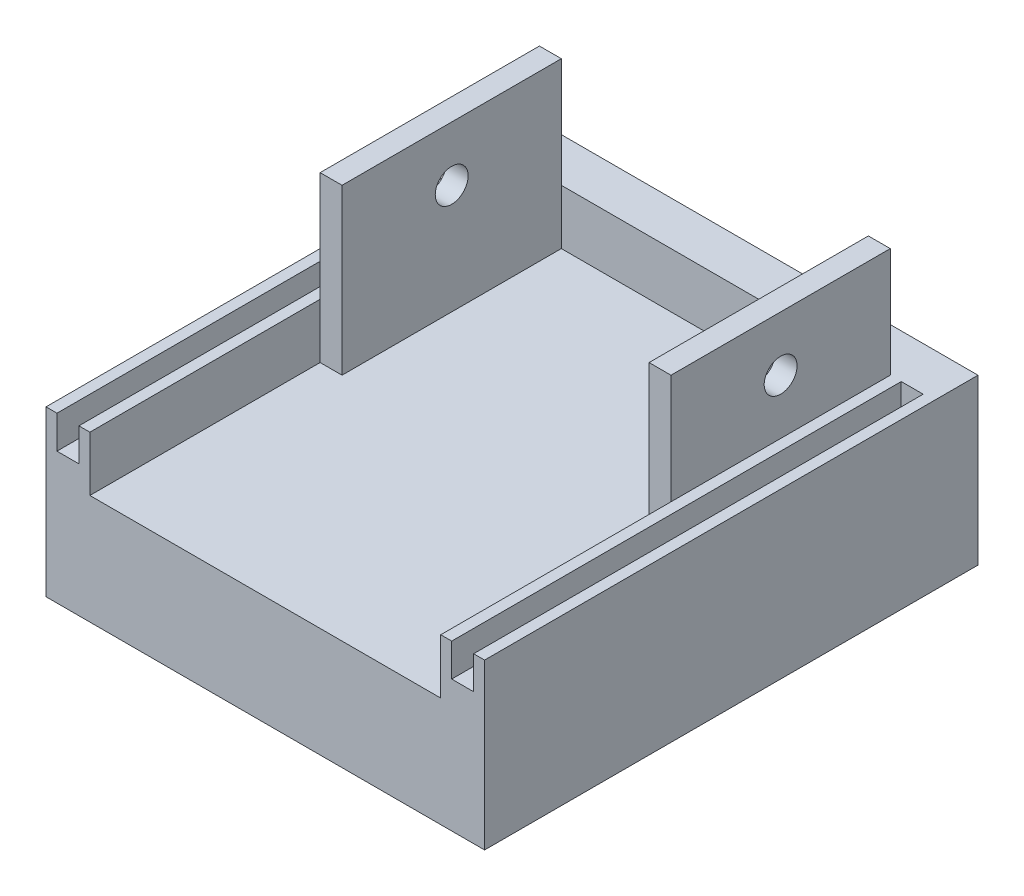
ISO-10303-21;
HEADER;
FILE_DESCRIPTION(('STEP AP214'),'2;1');
FILE_NAME('part.step','',(''),(''),'','','');
FILE_SCHEMA(('AUTOMOTIVE_DESIGN { 1 0 10303 214 1 1 1 1 }'));
ENDSEC;
DATA;
#1=APPLICATION_CONTEXT('core data for automotive mechanical design processes');
#2=APPLICATION_PROTOCOL_DEFINITION('international standard','automotive_design',2000,#1);
#3=PRODUCT_CONTEXT('',#1,'mechanical');
#4=PRODUCT('Part','Part','',(#3));
#5=PRODUCT_RELATED_PRODUCT_CATEGORY('part','',(#4));
#6=PRODUCT_DEFINITION_FORMATION('','',#4);
#7=PRODUCT_DEFINITION_CONTEXT('part definition',#1,'design');
#8=PRODUCT_DEFINITION('design','',#6,#7);
#9=PRODUCT_DEFINITION_SHAPE('','',#8);
#10=(LENGTH_UNIT() NAMED_UNIT(*) SI_UNIT(.MILLI.,.METRE.));
#11=(NAMED_UNIT(*) PLANE_ANGLE_UNIT() SI_UNIT($,.RADIAN.));
#12=(NAMED_UNIT(*) SI_UNIT($,.STERADIAN.) SOLID_ANGLE_UNIT());
#13=UNCERTAINTY_MEASURE_WITH_UNIT(LENGTH_MEASURE(1.E-05),#10,'distance_accuracy_value','');
#14=(GEOMETRIC_REPRESENTATION_CONTEXT(3) GLOBAL_UNCERTAINTY_ASSIGNED_CONTEXT((#13)) GLOBAL_UNIT_ASSIGNED_CONTEXT((#10,
#11,#12)) REPRESENTATION_CONTEXT('',''));
#15=CARTESIAN_POINT('',(0.,0.,0.));
#16=DIRECTION('',(0.,0.,1.));
#17=DIRECTION('',(1.,0.,0.));
#18=AXIS2_PLACEMENT_3D('',#15,#16,#17);
#19=CARTESIAN_POINT('',(0.,10.,0.));
#20=DIRECTION('',(0.,-1.,0.));
#21=DIRECTION('',(0.,0.,-1.));
#22=AXIS2_PLACEMENT_3D('',#19,#20,#21);
#23=PLANE('',#22);
#24=DIRECTION('',(-1.,0.,0.));
#25=VECTOR('',#24,1.);
#26=CARTESIAN_POINT('',(16.,10.,1.5));
#27=LINE('',#26,#25);
#28=CARTESIAN_POINT('',(16.,10.,1.5));
#29=VERTEX_POINT('',#28);
#30=CARTESIAN_POINT('',(14.,10.,1.5));
#31=VERTEX_POINT('',#30);
#32=EDGE_CURVE('E49',#29,#31,#27,.T.);
#33=ORIENTED_EDGE('',*,*,#32,.T.);
#34=DIRECTION('',(0.,0.,-1.));
#35=VECTOR('',#34,1.);
#36=CARTESIAN_POINT('',(14.,10.,-18.5));
#37=LINE('',#36,#35);
#38=CARTESIAN_POINT('',(14.,10.,-18.5));
#39=VERTEX_POINT('',#38);
#40=EDGE_CURVE('E54',#31,#39,#37,.T.);
#41=ORIENTED_EDGE('',*,*,#40,.T.);
#42=DIRECTION('',(1.,0.,0.));
#43=VECTOR('',#42,1.);
#44=CARTESIAN_POINT('',(-20.,10.,-18.5));
#45=LINE('',#44,#43);
#46=CARTESIAN_POINT('',(-14.,10.,-18.5));
#47=VERTEX_POINT('',#46);
#48=EDGE_CURVE('E346',#47,#39,#45,.T.);
#49=ORIENTED_EDGE('',*,*,#48,.F.);
#50=DIRECTION('',(0.,0.,-1.));
#51=VECTOR('',#50,1.);
#52=CARTESIAN_POINT('',(-14.,10.,-18.5));
#53=LINE('',#52,#51);
#54=CARTESIAN_POINT('',(-14.,10.,1.5));
#55=VERTEX_POINT('',#54);
#56=EDGE_CURVE('E243',#55,#47,#53,.T.);
#57=ORIENTED_EDGE('',*,*,#56,.F.);
#58=DIRECTION('',(1.,0.,0.));
#59=VECTOR('',#58,1.);
#60=CARTESIAN_POINT('',(-16.,10.,1.5));
#61=LINE('',#60,#59);
#62=CARTESIAN_POINT('',(-16.,10.,1.5));
#63=VERTEX_POINT('',#62);
#64=EDGE_CURVE('E238',#63,#55,#61,.T.);
#65=ORIENTED_EDGE('',*,*,#64,.F.);
#66=DIRECTION('',(0.,0.,-1.));
#67=VECTOR('',#66,1.);
#68=CARTESIAN_POINT('',(-16.,10.,22.5));
#69=LINE('',#68,#67);
#70=CARTESIAN_POINT('',(-16.,10.,22.5));
#71=VERTEX_POINT('',#70);
#72=EDGE_CURVE('E328',#71,#63,#69,.T.);
#73=ORIENTED_EDGE('',*,*,#72,.F.);
#74=DIRECTION('',(1.,0.,0.));
#75=VECTOR('',#74,1.);
#76=CARTESIAN_POINT('',(-20.,10.,22.5));
#77=LINE('',#76,#75);
#78=CARTESIAN_POINT('',(16.,10.,22.5));
#79=VERTEX_POINT('',#78);
#80=EDGE_CURVE('E362',#71,#79,#77,.T.);
#81=ORIENTED_EDGE('',*,*,#80,.T.);
#82=DIRECTION('',(0.,0.,-1.));
#83=VECTOR('',#82,1.);
#84=CARTESIAN_POINT('',(16.,10.,22.5));
#85=LINE('',#84,#83);
#86=EDGE_CURVE('E288',#79,#29,#85,.T.);
#87=ORIENTED_EDGE('',*,*,#86,.T.);
#88=EDGE_LOOP('',(#33,#41,#49,#57,#65,#73,#81,#87));
#89=FACE_BOUND('',#88,.T.);
#90=ADVANCED_FACE('F33',(#89),#23,.F.);
#91=CARTESIAN_POINT('',(-20.,15.,-18.5));
#92=DIRECTION('',(0.,0.,-1.));
#93=DIRECTION('',(-1.,0.,0.));
#94=AXIS2_PLACEMENT_3D('',#91,#92,#93);
#95=PLANE('',#94);
#96=ORIENTED_EDGE('',*,*,#48,.T.);
#97=DIRECTION('',(0.,-1.,0.));
#98=VECTOR('',#97,1.);
#99=CARTESIAN_POINT('',(14.,25.,-18.5));
#100=LINE('',#99,#98);
#101=CARTESIAN_POINT('',(14.,15.,-18.5));
#102=VERTEX_POINT('',#101);
#103=EDGE_CURVE('E235',#102,#39,#100,.T.);
#104=ORIENTED_EDGE('',*,*,#103,.F.);
#105=DIRECTION('',(1.,0.,0.));
#106=VECTOR('',#105,1.);
#107=CARTESIAN_POINT('',(-20.,15.,-18.5));
#108=LINE('',#107,#106);
#109=CARTESIAN_POINT('',(-14.,15.,-18.5));
#110=VERTEX_POINT('',#109);
#111=EDGE_CURVE('E350',#110,#102,#108,.T.);
#112=ORIENTED_EDGE('',*,*,#111,.F.);
#113=DIRECTION('',(0.,-1.,0.));
#114=VECTOR('',#113,1.);
#115=CARTESIAN_POINT('',(-14.,25.,-18.5));
#116=LINE('',#115,#114);
#117=EDGE_CURVE('E256',#110,#47,#116,.T.);
#118=ORIENTED_EDGE('',*,*,#117,.T.);
#119=EDGE_LOOP('',(#96,#104,#112,#118));
#120=FACE_BOUND('',#119,.T.);
#121=ADVANCED_FACE('F416',(#120),#95,.F.);
#122=CARTESIAN_POINT('',(-16.,15.,22.5));
#123=DIRECTION('',(-1.,0.,0.));
#124=DIRECTION('',(0.,0.,1.));
#125=AXIS2_PLACEMENT_3D('',#122,#123,#124);
#126=PLANE('',#125);
#127=DIRECTION('',(0.,-1.,0.));
#128=VECTOR('',#127,1.);
#129=CARTESIAN_POINT('',(-16.,15.,1.5));
#130=LINE('',#129,#128);
#131=CARTESIAN_POINT('',(-16.,15.,1.5));
#132=VERTEX_POINT('',#131);
#133=EDGE_CURVE('E42',#132,#63,#130,.T.);
#134=ORIENTED_EDGE('',*,*,#133,.F.);
#135=DIRECTION('',(0.,0.,-1.));
#136=VECTOR('',#135,1.);
#137=CARTESIAN_POINT('',(-16.,15.,22.5));
#138=LINE('',#137,#136);
#139=CARTESIAN_POINT('',(-16.,15.,22.5));
#140=VERTEX_POINT('',#139);
#141=EDGE_CURVE('E340',#140,#132,#138,.T.);
#142=ORIENTED_EDGE('',*,*,#141,.F.);
#143=DIRECTION('',(0.,-1.,0.));
#144=VECTOR('',#143,1.);
#145=CARTESIAN_POINT('',(-16.,15.,22.5));
#146=LINE('',#145,#144);
#147=EDGE_CURVE('E343',#140,#71,#146,.T.);
#148=ORIENTED_EDGE('',*,*,#147,.T.);
#149=ORIENTED_EDGE('',*,*,#72,.T.);
#150=EDGE_LOOP('',(#134,#142,#148,#149));
#151=FACE_BOUND('',#150,.T.);
#152=ADVANCED_FACE('F393',(#151),#126,.F.);
#153=CARTESIAN_POINT('',(-20.,10.,22.5));
#154=DIRECTION('',(0.,0.,-1.));
#155=DIRECTION('',(-1.,0.,0.));
#156=AXIS2_PLACEMENT_3D('',#153,#154,#155);
#157=PLANE('',#156);
#158=DIRECTION('',(0.,1.,0.));
#159=VECTOR('',#158,1.);
#160=CARTESIAN_POINT('',(19.,12.,22.5));
#161=LINE('',#160,#159);
#162=CARTESIAN_POINT('',(19.,12.,22.5));
#163=VERTEX_POINT('',#162);
#164=CARTESIAN_POINT('',(19.,15.,22.5));
#165=VERTEX_POINT('',#164);
#166=EDGE_CURVE('E286',#163,#165,#161,.T.);
#167=ORIENTED_EDGE('',*,*,#166,.F.);
#168=DIRECTION('',(-1.,0.,0.));
#169=VECTOR('',#168,1.);
#170=CARTESIAN_POINT('',(19.,12.,22.5));
#171=LINE('',#170,#169);
#172=CARTESIAN_POINT('',(17.,12.,22.5));
#173=VERTEX_POINT('',#172);
#174=EDGE_CURVE('E275',#163,#173,#171,.T.);
#175=ORIENTED_EDGE('',*,*,#174,.T.);
#176=DIRECTION('',(0.,1.,0.));
#177=VECTOR('',#176,1.);
#178=CARTESIAN_POINT('',(17.,12.,22.5));
#179=LINE('',#178,#177);
#180=CARTESIAN_POINT('',(17.,15.,22.5));
#181=VERTEX_POINT('',#180);
#182=EDGE_CURVE('E289',#173,#181,#179,.T.);
#183=ORIENTED_EDGE('',*,*,#182,.T.);
#184=DIRECTION('',(-1.,0.,0.));
#185=VECTOR('',#184,1.);
#186=CARTESIAN_POINT('',(20.,15.,22.5));
#187=LINE('',#186,#185);
#188=CARTESIAN_POINT('',(16.,15.,22.5));
#189=VERTEX_POINT('',#188);
#190=EDGE_CURVE('E298',#181,#189,#187,.T.);
#191=ORIENTED_EDGE('',*,*,#190,.T.);
#192=DIRECTION('',(0.,-1.,0.));
#193=VECTOR('',#192,1.);
#194=CARTESIAN_POINT('',(16.,15.,22.5));
#195=LINE('',#194,#193);
#196=EDGE_CURVE('E302',#189,#79,#195,.T.);
#197=ORIENTED_EDGE('',*,*,#196,.T.);
#198=ORIENTED_EDGE('',*,*,#80,.F.);
#199=ORIENTED_EDGE('',*,*,#147,.F.);
#200=DIRECTION('',(1.,0.,0.));
#201=VECTOR('',#200,1.);
#202=CARTESIAN_POINT('',(-20.,15.,22.5));
#203=LINE('',#202,#201);
#204=CARTESIAN_POINT('',(-17.,15.,22.5));
#205=VERTEX_POINT('',#204);
#206=EDGE_CURVE('E339',#205,#140,#203,.T.);
#207=ORIENTED_EDGE('',*,*,#206,.F.);
#208=DIRECTION('',(0.,1.,0.));
#209=VECTOR('',#208,1.);
#210=CARTESIAN_POINT('',(-17.,12.,22.5));
#211=LINE('',#210,#209);
#212=CARTESIAN_POINT('',(-17.,12.,22.5));
#213=VERTEX_POINT('',#212);
#214=EDGE_CURVE('E331',#213,#205,#211,.T.);
#215=ORIENTED_EDGE('',*,*,#214,.F.);
#216=DIRECTION('',(1.,0.,0.));
#217=VECTOR('',#216,1.);
#218=CARTESIAN_POINT('',(-19.,12.,22.5));
#219=LINE('',#218,#217);
#220=CARTESIAN_POINT('',(-19.,12.,22.5));
#221=VERTEX_POINT('',#220);
#222=EDGE_CURVE('E309',#221,#213,#219,.T.);
#223=ORIENTED_EDGE('',*,*,#222,.F.);
#224=DIRECTION('',(0.,1.,0.));
#225=VECTOR('',#224,1.);
#226=CARTESIAN_POINT('',(-19.,12.,22.5));
#227=LINE('',#226,#225);
#228=CARTESIAN_POINT('',(-19.,15.,22.5));
#229=VERTEX_POINT('',#228);
#230=EDGE_CURVE('E319',#221,#229,#227,.T.);
#231=ORIENTED_EDGE('',*,*,#230,.T.);
#232=CARTESIAN_POINT('',(-20.,15.,22.5));
#233=VERTEX_POINT('',#232);
#234=EDGE_CURVE('E335',#233,#229,#203,.T.);
#235=ORIENTED_EDGE('',*,*,#234,.F.);
#236=DIRECTION('',(0.,-1.,0.));
#237=VECTOR('',#236,1.);
#238=CARTESIAN_POINT('',(-20.,10.,22.5));
#239=LINE('',#238,#237);
#240=CARTESIAN_POINT('',(-20.,0.,22.5));
#241=VERTEX_POINT('',#240);
#242=EDGE_CURVE('E376',#233,#241,#239,.T.);
#243=ORIENTED_EDGE('',*,*,#242,.T.);
#244=DIRECTION('',(1.,0.,0.));
#245=VECTOR('',#244,1.);
#246=CARTESIAN_POINT('',(-20.,0.,22.5));
#247=LINE('',#246,#245);
#248=CARTESIAN_POINT('',(20.,0.,22.5));
#249=VERTEX_POINT('',#248);
#250=EDGE_CURVE('E366',#241,#249,#247,.T.);
#251=ORIENTED_EDGE('',*,*,#250,.T.);
#252=DIRECTION('',(0.,-1.,0.));
#253=VECTOR('',#252,1.);
#254=CARTESIAN_POINT('',(20.,10.,22.5));
#255=LINE('',#254,#253);
#256=CARTESIAN_POINT('',(20.,15.,22.5));
#257=VERTEX_POINT('',#256);
#258=EDGE_CURVE('E365',#257,#249,#255,.T.);
#259=ORIENTED_EDGE('',*,*,#258,.F.);
#260=EDGE_CURVE('E299',#257,#165,#187,.T.);
#261=ORIENTED_EDGE('',*,*,#260,.T.);
#262=EDGE_LOOP('',(#167,#175,#183,#191,#197,#198,#199,#207,#215,#223,#231,#235,#243,#251,#259,#261));
#263=FACE_BOUND('',#262,.T.);
#264=ADVANCED_FACE('F421',(#263),#157,.F.);
#265=CARTESIAN_POINT('',(0.,15.,0.));
#266=DIRECTION('',(0.,1.,0.));
#267=DIRECTION('',(0.,0.,1.));
#268=AXIS2_PLACEMENT_3D('',#265,#266,#267);
#269=PLANE('',#268);
#270=DIRECTION('',(1.,0.,0.));
#271=VECTOR('',#270,1.);
#272=CARTESIAN_POINT('',(19.,15.,-18.5));
#273=LINE('',#272,#271);
#274=CARTESIAN_POINT('',(17.,15.,-18.5));
#275=VERTEX_POINT('',#274);
#276=CARTESIAN_POINT('',(19.,15.,-18.5));
#277=VERTEX_POINT('',#276);
#278=EDGE_CURVE('E281',#275,#277,#273,.T.);
#279=ORIENTED_EDGE('',*,*,#278,.T.);
#280=DIRECTION('',(0.,0.,1.));
#281=VECTOR('',#280,1.);
#282=CARTESIAN_POINT('',(19.,15.,22.5));
#283=LINE('',#282,#281);
#284=EDGE_CURVE('E266',#277,#165,#283,.T.);
#285=ORIENTED_EDGE('',*,*,#284,.T.);
#286=ORIENTED_EDGE('',*,*,#260,.F.);
#287=DIRECTION('',(0.,0.,-1.));
#288=VECTOR('',#287,1.);
#289=CARTESIAN_POINT('',(20.,15.,-22.5));
#290=LINE('',#289,#288);
#291=CARTESIAN_POINT('',(20.,15.,-22.5));
#292=VERTEX_POINT('',#291);
#293=EDGE_CURVE('E354',#257,#292,#290,.T.);
#294=ORIENTED_EDGE('',*,*,#293,.T.);
#295=DIRECTION('',(-1.,0.,0.));
#296=VECTOR('',#295,1.);
#297=CARTESIAN_POINT('',(-20.,15.,-22.5));
#298=LINE('',#297,#296);
#299=CARTESIAN_POINT('',(-20.,15.,-22.5));
#300=VERTEX_POINT('',#299);
#301=EDGE_CURVE('E357',#292,#300,#298,.T.);
#302=ORIENTED_EDGE('',*,*,#301,.T.);
#303=DIRECTION('',(0.,0.,1.));
#304=VECTOR('',#303,1.);
#305=CARTESIAN_POINT('',(-20.,15.,-22.5));
#306=LINE('',#305,#304);
#307=EDGE_CURVE('E347',#300,#233,#306,.T.);
#308=ORIENTED_EDGE('',*,*,#307,.T.);
#309=ORIENTED_EDGE('',*,*,#234,.T.);
#310=DIRECTION('',(0.,0.,1.));
#311=VECTOR('',#310,1.);
#312=CARTESIAN_POINT('',(-19.,15.,22.5));
#313=LINE('',#312,#311);
#314=CARTESIAN_POINT('',(-19.,15.,-18.5));
#315=VERTEX_POINT('',#314);
#316=EDGE_CURVE('E305',#315,#229,#313,.T.);
#317=ORIENTED_EDGE('',*,*,#316,.F.);
#318=DIRECTION('',(-1.,0.,0.));
#319=VECTOR('',#318,1.);
#320=CARTESIAN_POINT('',(-19.,15.,-18.5));
#321=LINE('',#320,#319);
#322=CARTESIAN_POINT('',(-17.,15.,-18.5));
#323=VERTEX_POINT('',#322);
#324=EDGE_CURVE('E310',#323,#315,#321,.T.);
#325=ORIENTED_EDGE('',*,*,#324,.F.);
#326=DIRECTION('',(0.,0.,-1.));
#327=VECTOR('',#326,1.);
#328=CARTESIAN_POINT('',(-17.,15.,22.5));
#329=LINE('',#328,#327);
#330=EDGE_CURVE('E321',#205,#323,#329,.T.);
#331=ORIENTED_EDGE('',*,*,#330,.F.);
#332=ORIENTED_EDGE('',*,*,#206,.T.);
#333=ORIENTED_EDGE('',*,*,#141,.T.);
#334=CARTESIAN_POINT('',(-16.,15.,-18.5));
#335=VERTEX_POINT('',#334);
#336=EDGE_CURVE('E338',#132,#335,#138,.T.);
#337=ORIENTED_EDGE('',*,*,#336,.T.);
#338=EDGE_CURVE('E351',#335,#110,#108,.T.);
#339=ORIENTED_EDGE('',*,*,#338,.T.);
#340=ORIENTED_EDGE('',*,*,#111,.T.);
#341=DIRECTION('',(-1.,0.,0.));
#342=VECTOR('',#341,1.);
#343=CARTESIAN_POINT('',(0.,15.,-18.5));
#344=LINE('',#343,#342);
#345=CARTESIAN_POINT('',(16.,15.,-18.5));
#346=VERTEX_POINT('',#345);
#347=EDGE_CURVE('E208',#346,#102,#344,.T.);
#348=ORIENTED_EDGE('',*,*,#347,.F.);
#349=DIRECTION('',(0.,0.,-1.));
#350=VECTOR('',#349,1.);
#351=CARTESIAN_POINT('',(16.,15.,22.5));
#352=LINE('',#351,#350);
#353=CARTESIAN_POINT('',(16.,15.,1.5));
#354=VERTEX_POINT('',#353);
#355=EDGE_CURVE('E204',#354,#346,#352,.T.);
#356=ORIENTED_EDGE('',*,*,#355,.F.);
#357=EDGE_CURVE('E296',#189,#354,#352,.T.);
#358=ORIENTED_EDGE('',*,*,#357,.F.);
#359=ORIENTED_EDGE('',*,*,#190,.F.);
#360=DIRECTION('',(0.,0.,-1.));
#361=VECTOR('',#360,1.);
#362=CARTESIAN_POINT('',(17.,15.,22.5));
#363=LINE('',#362,#361);
#364=EDGE_CURVE('E271',#181,#275,#363,.T.);
#365=ORIENTED_EDGE('',*,*,#364,.T.);
#366=EDGE_LOOP('',(#279,#285,#286,#294,#302,#308,#309,#317,#325,#331,#332,#333,#337,#339,#340,
#348,#356,#358,#359,#365));
#367=FACE_BOUND('',#366,.T.);
#368=ADVANCED_FACE('F397',(#367),#269,.T.);
#369=CARTESIAN_POINT('',(20.,10.,22.5));
#370=DIRECTION('',(-1.,0.,0.));
#371=DIRECTION('',(0.,0.,1.));
#372=AXIS2_PLACEMENT_3D('',#369,#370,#371);
#373=PLANE('',#372);
#374=DIRECTION('',(0.,0.,-1.));
#375=VECTOR('',#374,1.);
#376=CARTESIAN_POINT('',(20.,0.,22.5));
#377=LINE('',#376,#375);
#378=CARTESIAN_POINT('',(20.,0.,-22.5));
#379=VERTEX_POINT('',#378);
#380=EDGE_CURVE('E360',#249,#379,#377,.T.);
#381=ORIENTED_EDGE('',*,*,#380,.T.);
#382=DIRECTION('',(0.,-1.,0.));
#383=VECTOR('',#382,1.);
#384=CARTESIAN_POINT('',(20.,10.,-22.5));
#385=LINE('',#384,#383);
#386=EDGE_CURVE('E382',#292,#379,#385,.T.);
#387=ORIENTED_EDGE('',*,*,#386,.F.);
#388=ORIENTED_EDGE('',*,*,#293,.F.);
#389=ORIENTED_EDGE('',*,*,#258,.T.);
#390=EDGE_LOOP('',(#381,#387,#388,#389));
#391=FACE_BOUND('',#390,.T.);
#392=ADVANCED_FACE('F35',(#391),#373,.F.);
#393=CARTESIAN_POINT('',(-20.,10.,-22.5));
#394=DIRECTION('',(0.,0.,1.));
#395=DIRECTION('',(1.,0.,0.));
#396=AXIS2_PLACEMENT_3D('',#393,#394,#395);
#397=PLANE('',#396);
#398=DIRECTION('',(-1.,0.,0.));
#399=VECTOR('',#398,1.);
#400=CARTESIAN_POINT('',(-20.,0.,-22.5));
#401=LINE('',#400,#399);
#402=CARTESIAN_POINT('',(-20.,0.,-22.5));
#403=VERTEX_POINT('',#402);
#404=EDGE_CURVE('E369',#379,#403,#401,.T.);
#405=ORIENTED_EDGE('',*,*,#404,.T.);
#406=DIRECTION('',(0.,-1.,0.));
#407=VECTOR('',#406,1.);
#408=CARTESIAN_POINT('',(-20.,10.,-22.5));
#409=LINE('',#408,#407);
#410=EDGE_CURVE('E379',#300,#403,#409,.T.);
#411=ORIENTED_EDGE('',*,*,#410,.F.);
#412=ORIENTED_EDGE('',*,*,#301,.F.);
#413=ORIENTED_EDGE('',*,*,#386,.T.);
#414=EDGE_LOOP('',(#405,#411,#412,#413));
#415=FACE_BOUND('',#414,.T.);
#416=ADVANCED_FACE('F461',(#415),#397,.F.);
#417=CARTESIAN_POINT('',(-20.,10.,22.5));
#418=DIRECTION('',(1.,0.,0.));
#419=DIRECTION('',(0.,0.,-1.));
#420=AXIS2_PLACEMENT_3D('',#417,#418,#419);
#421=PLANE('',#420);
#422=ORIENTED_EDGE('',*,*,#242,.F.);
#423=ORIENTED_EDGE('',*,*,#307,.F.);
#424=ORIENTED_EDGE('',*,*,#410,.T.);
#425=DIRECTION('',(0.,0.,1.));
#426=VECTOR('',#425,1.);
#427=CARTESIAN_POINT('',(-20.,0.,22.5));
#428=LINE('',#427,#426);
#429=EDGE_CURVE('E371',#403,#241,#428,.T.);
#430=ORIENTED_EDGE('',*,*,#429,.T.);
#431=EDGE_LOOP('',(#422,#423,#424,#430));
#432=FACE_BOUND('',#431,.T.);
#433=ADVANCED_FACE('F456',(#432),#421,.F.);
#434=CARTESIAN_POINT('',(0.,0.,0.));
#435=DIRECTION('',(0.,-1.,0.));
#436=DIRECTION('',(0.,0.,-1.));
#437=AXIS2_PLACEMENT_3D('',#434,#435,#436);
#438=PLANE('',#437);
#439=ORIENTED_EDGE('',*,*,#380,.F.);
#440=ORIENTED_EDGE('',*,*,#250,.F.);
#441=ORIENTED_EDGE('',*,*,#429,.F.);
#442=ORIENTED_EDGE('',*,*,#404,.F.);
#443=EDGE_LOOP('',(#439,#440,#441,#442));
#444=FACE_BOUND('',#443,.T.);
#445=ADVANCED_FACE('F452',(#444),#438,.T.);
#446=CARTESIAN_POINT('',(-19.,12.,22.5));
#447=DIRECTION('',(-1.,0.,0.));
#448=DIRECTION('',(0.,0.,1.));
#449=AXIS2_PLACEMENT_3D('',#446,#447,#448);
#450=PLANE('',#449);
#451=ORIENTED_EDGE('',*,*,#316,.T.);
#452=ORIENTED_EDGE('',*,*,#230,.F.);
#453=DIRECTION('',(0.,0.,1.));
#454=VECTOR('',#453,1.);
#455=CARTESIAN_POINT('',(-19.,12.,22.5));
#456=LINE('',#455,#454);
#457=CARTESIAN_POINT('',(-19.,12.,-18.5));
#458=VERTEX_POINT('',#457);
#459=EDGE_CURVE('E306',#458,#221,#456,.T.);
#460=ORIENTED_EDGE('',*,*,#459,.F.);
#461=DIRECTION('',(0.,1.,0.));
#462=VECTOR('',#461,1.);
#463=CARTESIAN_POINT('',(-19.,12.,-18.5));
#464=LINE('',#463,#462);
#465=EDGE_CURVE('E326',#458,#315,#464,.T.);
#466=ORIENTED_EDGE('',*,*,#465,.T.);
#467=EDGE_LOOP('',(#451,#452,#460,#466));
#468=FACE_BOUND('',#467,.T.);
#469=ADVANCED_FACE('F455',(#468),#450,.F.);
#470=CARTESIAN_POINT('',(-19.,12.,-18.5));
#471=DIRECTION('',(0.,0.,-1.));
#472=DIRECTION('',(-1.,0.,0.));
#473=AXIS2_PLACEMENT_3D('',#470,#471,#472);
#474=PLANE('',#473);
#475=ORIENTED_EDGE('',*,*,#324,.T.);
#476=ORIENTED_EDGE('',*,*,#465,.F.);
#477=DIRECTION('',(-1.,0.,0.));
#478=VECTOR('',#477,1.);
#479=CARTESIAN_POINT('',(-19.,12.,-18.5));
#480=LINE('',#479,#478);
#481=CARTESIAN_POINT('',(-17.,12.,-18.5));
#482=VERTEX_POINT('',#481);
#483=EDGE_CURVE('E316',#482,#458,#480,.T.);
#484=ORIENTED_EDGE('',*,*,#483,.F.);
#485=DIRECTION('',(0.,1.,0.));
#486=VECTOR('',#485,1.);
#487=CARTESIAN_POINT('',(-17.,12.,-18.5));
#488=LINE('',#487,#486);
#489=EDGE_CURVE('E329',#482,#323,#488,.T.);
#490=ORIENTED_EDGE('',*,*,#489,.T.);
#491=EDGE_LOOP('',(#475,#476,#484,#490));
#492=FACE_BOUND('',#491,.T.);
#493=ADVANCED_FACE('F509',(#492),#474,.F.);
#494=CARTESIAN_POINT('',(-17.,12.,22.5));
#495=DIRECTION('',(1.,0.,0.));
#496=DIRECTION('',(0.,0.,-1.));
#497=AXIS2_PLACEMENT_3D('',#494,#495,#496);
#498=PLANE('',#497);
#499=ORIENTED_EDGE('',*,*,#330,.T.);
#500=ORIENTED_EDGE('',*,*,#489,.F.);
#501=DIRECTION('',(0.,0.,-1.));
#502=VECTOR('',#501,1.);
#503=CARTESIAN_POINT('',(-17.,12.,22.5));
#504=LINE('',#503,#502);
#505=EDGE_CURVE('E313',#213,#482,#504,.T.);
#506=ORIENTED_EDGE('',*,*,#505,.F.);
#507=ORIENTED_EDGE('',*,*,#214,.T.);
#508=EDGE_LOOP('',(#499,#500,#506,#507));
#509=FACE_BOUND('',#508,.T.);
#510=ADVANCED_FACE('F507',(#509),#498,.F.);
#511=CARTESIAN_POINT('',(0.,12.,0.));
#512=DIRECTION('',(0.,-1.,0.));
#513=DIRECTION('',(0.,0.,-1.));
#514=AXIS2_PLACEMENT_3D('',#511,#512,#513);
#515=PLANE('',#514);
#516=ORIENTED_EDGE('',*,*,#459,.T.);
#517=ORIENTED_EDGE('',*,*,#222,.T.);
#518=ORIENTED_EDGE('',*,*,#505,.T.);
#519=ORIENTED_EDGE('',*,*,#483,.T.);
#520=EDGE_LOOP('',(#516,#517,#518,#519));
#521=FACE_BOUND('',#520,.T.);
#522=ADVANCED_FACE('F504',(#521),#515,.F.);
#523=CARTESIAN_POINT('',(16.,15.,22.5));
#524=DIRECTION('',(-1.,0.,0.));
#525=DIRECTION('',(0.,0.,1.));
#526=AXIS2_PLACEMENT_3D('',#523,#524,#525);
#527=PLANE('',#526);
#528=DIRECTION('',(0.,1.,0.));
#529=VECTOR('',#528,1.);
#530=CARTESIAN_POINT('',(16.,15.,1.5));
#531=LINE('',#530,#529);
#532=EDGE_CURVE('E11',#29,#354,#531,.T.);
#533=ORIENTED_EDGE('',*,*,#532,.F.);
#534=ORIENTED_EDGE('',*,*,#86,.F.);
#535=ORIENTED_EDGE('',*,*,#196,.F.);
#536=ORIENTED_EDGE('',*,*,#357,.T.);
#537=EDGE_LOOP('',(#533,#534,#535,#536));
#538=FACE_BOUND('',#537,.T.);
#539=ADVANCED_FACE('F427',(#538),#527,.T.);
#540=CARTESIAN_POINT('',(19.,12.,22.5));
#541=DIRECTION('',(-1.,0.,0.));
#542=DIRECTION('',(0.,0.,1.));
#543=AXIS2_PLACEMENT_3D('',#540,#541,#542);
#544=PLANE('',#543);
#545=ORIENTED_EDGE('',*,*,#284,.F.);
#546=DIRECTION('',(0.,1.,0.));
#547=VECTOR('',#546,1.);
#548=CARTESIAN_POINT('',(19.,12.,-18.5));
#549=LINE('',#548,#547);
#550=CARTESIAN_POINT('',(19.,12.,-18.5));
#551=VERTEX_POINT('',#550);
#552=EDGE_CURVE('E278',#551,#277,#549,.T.);
#553=ORIENTED_EDGE('',*,*,#552,.F.);
#554=DIRECTION('',(0.,0.,1.));
#555=VECTOR('',#554,1.);
#556=CARTESIAN_POINT('',(19.,12.,22.5));
#557=LINE('',#556,#555);
#558=EDGE_CURVE('E267',#551,#163,#557,.T.);
#559=ORIENTED_EDGE('',*,*,#558,.T.);
#560=ORIENTED_EDGE('',*,*,#166,.T.);
#561=EDGE_LOOP('',(#545,#553,#559,#560));
#562=FACE_BOUND('',#561,.T.);
#563=ADVANCED_FACE('F478',(#562),#544,.T.);
#564=CARTESIAN_POINT('',(17.,12.,22.5));
#565=DIRECTION('',(1.,0.,0.));
#566=DIRECTION('',(0.,0.,-1.));
#567=AXIS2_PLACEMENT_3D('',#564,#565,#566);
#568=PLANE('',#567);
#569=ORIENTED_EDGE('',*,*,#364,.F.);
#570=ORIENTED_EDGE('',*,*,#182,.F.);
#571=DIRECTION('',(0.,0.,-1.));
#572=VECTOR('',#571,1.);
#573=CARTESIAN_POINT('',(17.,12.,22.5));
#574=LINE('',#573,#572);
#575=CARTESIAN_POINT('',(17.,12.,-18.5));
#576=VERTEX_POINT('',#575);
#577=EDGE_CURVE('E273',#173,#576,#574,.T.);
#578=ORIENTED_EDGE('',*,*,#577,.T.);
#579=DIRECTION('',(0.,1.,0.));
#580=VECTOR('',#579,1.);
#581=CARTESIAN_POINT('',(17.,12.,-18.5));
#582=LINE('',#581,#580);
#583=EDGE_CURVE('E292',#576,#275,#582,.T.);
#584=ORIENTED_EDGE('',*,*,#583,.T.);
#585=EDGE_LOOP('',(#569,#570,#578,#584));
#586=FACE_BOUND('',#585,.T.);
#587=ADVANCED_FACE('F487',(#586),#568,.T.);
#588=CARTESIAN_POINT('',(19.,12.,-18.5));
#589=DIRECTION('',(0.,0.,1.));
#590=DIRECTION('',(1.,0.,0.));
#591=AXIS2_PLACEMENT_3D('',#588,#589,#590);
#592=PLANE('',#591);
#593=ORIENTED_EDGE('',*,*,#278,.F.);
#594=ORIENTED_EDGE('',*,*,#583,.F.);
#595=DIRECTION('',(1.,0.,0.));
#596=VECTOR('',#595,1.);
#597=CARTESIAN_POINT('',(19.,12.,-18.5));
#598=LINE('',#597,#596);
#599=EDGE_CURVE('E270',#576,#551,#598,.T.);
#600=ORIENTED_EDGE('',*,*,#599,.T.);
#601=ORIENTED_EDGE('',*,*,#552,.T.);
#602=EDGE_LOOP('',(#593,#594,#600,#601));
#603=FACE_BOUND('',#602,.T.);
#604=ADVANCED_FACE('F490',(#603),#592,.T.);
#605=CARTESIAN_POINT('',(0.,12.,0.));
#606=DIRECTION('',(0.,-1.,0.));
#607=DIRECTION('',(0.,0.,-1.));
#608=AXIS2_PLACEMENT_3D('',#605,#606,#607);
#609=PLANE('',#608);
#610=ORIENTED_EDGE('',*,*,#558,.F.);
#611=ORIENTED_EDGE('',*,*,#599,.F.);
#612=ORIENTED_EDGE('',*,*,#577,.F.);
#613=ORIENTED_EDGE('',*,*,#174,.F.);
#614=EDGE_LOOP('',(#610,#611,#612,#613));
#615=FACE_BOUND('',#614,.T.);
#616=ADVANCED_FACE('F483',(#615),#609,.F.);
#617=CARTESIAN_POINT('',(-16.,25.,-18.5));
#618=DIRECTION('',(1.,0.,0.));
#619=DIRECTION('',(0.,0.,-1.));
#620=AXIS2_PLACEMENT_3D('',#617,#618,#619);
#621=PLANE('',#620);
#622=CARTESIAN_POINT('',(-16.,20.,-8.5));
#623=DIRECTION('',(1.,0.,0.));
#624=DIRECTION('',(0.,0.,-1.));
#625=AXIS2_PLACEMENT_3D('',#622,#623,#624);
#626=CIRCLE('',#625,1.5);
#627=CARTESIAN_POINT('',(-16.,20.,-10.));
#628=VERTEX_POINT('',#627);
#629=EDGE_CURVE('E230',#628,#628,#626,.T.);
#630=ORIENTED_EDGE('',*,*,#629,.T.);
#631=EDGE_LOOP('',(#630));
#632=FACE_BOUND('',#631,.T.);
#633=ORIENTED_EDGE('',*,*,#336,.F.);
#634=DIRECTION('',(0.,-1.,0.));
#635=VECTOR('',#634,1.);
#636=CARTESIAN_POINT('',(-16.,25.,1.5));
#637=LINE('',#636,#635);
#638=CARTESIAN_POINT('',(-16.,25.,1.5));
#639=VERTEX_POINT('',#638);
#640=EDGE_CURVE('E263',#639,#132,#637,.T.);
#641=ORIENTED_EDGE('',*,*,#640,.F.);
#642=DIRECTION('',(0.,0.,1.));
#643=VECTOR('',#642,1.);
#644=CARTESIAN_POINT('',(-16.,25.,-18.5));
#645=LINE('',#644,#643);
#646=CARTESIAN_POINT('',(-16.,25.,-18.5));
#647=VERTEX_POINT('',#646);
#648=EDGE_CURVE('E239',#647,#639,#645,.T.);
#649=ORIENTED_EDGE('',*,*,#648,.F.);
#650=DIRECTION('',(0.,-1.,0.));
#651=VECTOR('',#650,1.);
#652=CARTESIAN_POINT('',(-16.,25.,-18.5));
#653=LINE('',#652,#651);
#654=EDGE_CURVE('E249',#647,#335,#653,.T.);
#655=ORIENTED_EDGE('',*,*,#654,.T.);
#656=EDGE_LOOP('',(#633,#641,#649,#655));
#657=FACE_BOUND('',#656,.T.);
#658=ADVANCED_FACE('F403',(#632,#657),#621,.F.);
#659=CARTESIAN_POINT('',(-16.,25.,1.5));
#660=DIRECTION('',(0.,0.,-1.));
#661=DIRECTION('',(-1.,0.,0.));
#662=AXIS2_PLACEMENT_3D('',#659,#660,#661);
#663=PLANE('',#662);
#664=ORIENTED_EDGE('',*,*,#64,.T.);
#665=DIRECTION('',(0.,-1.,0.));
#666=VECTOR('',#665,1.);
#667=CARTESIAN_POINT('',(-14.,25.,1.5));
#668=LINE('',#667,#666);
#669=CARTESIAN_POINT('',(-14.,25.,1.5));
#670=VERTEX_POINT('',#669);
#671=EDGE_CURVE('E260',#670,#55,#668,.T.);
#672=ORIENTED_EDGE('',*,*,#671,.F.);
#673=DIRECTION('',(1.,0.,0.));
#674=VECTOR('',#673,1.);
#675=CARTESIAN_POINT('',(-16.,25.,1.5));
#676=LINE('',#675,#674);
#677=EDGE_CURVE('E242',#639,#670,#676,.T.);
#678=ORIENTED_EDGE('',*,*,#677,.F.);
#679=ORIENTED_EDGE('',*,*,#640,.T.);
#680=ORIENTED_EDGE('',*,*,#133,.T.);
#681=EDGE_LOOP('',(#664,#672,#678,#679,#680));
#682=FACE_BOUND('',#681,.T.);
#683=ADVANCED_FACE('F387',(#682),#663,.F.);
#684=CARTESIAN_POINT('',(-14.,25.,-18.5));
#685=DIRECTION('',(-1.,0.,0.));
#686=DIRECTION('',(0.,0.,1.));
#687=AXIS2_PLACEMENT_3D('',#684,#685,#686);
#688=PLANE('',#687);
#689=CARTESIAN_POINT('',(-14.,20.,-8.5));
#690=DIRECTION('',(-1.,0.,0.));
#691=DIRECTION('',(0.,0.,1.));
#692=AXIS2_PLACEMENT_3D('',#689,#690,#691);
#693=CIRCLE('',#692,1.5);
#694=CARTESIAN_POINT('',(-14.,20.,-7.));
#695=VERTEX_POINT('',#694);
#696=EDGE_CURVE('E671',#695,#695,#693,.T.);
#697=ORIENTED_EDGE('',*,*,#696,.T.);
#698=EDGE_LOOP('',(#697));
#699=FACE_BOUND('',#698,.T.);
#700=ORIENTED_EDGE('',*,*,#56,.T.);
#701=ORIENTED_EDGE('',*,*,#117,.F.);
#702=CARTESIAN_POINT('',(-14.,25.,-18.5));
#703=VERTEX_POINT('',#702);
#704=EDGE_CURVE('E257',#703,#110,#116,.T.);
#705=ORIENTED_EDGE('',*,*,#704,.F.);
#706=DIRECTION('',(0.,0.,-1.));
#707=VECTOR('',#706,1.);
#708=CARTESIAN_POINT('',(-14.,25.,-18.5));
#709=LINE('',#708,#707);
#710=EDGE_CURVE('E245',#670,#703,#709,.T.);
#711=ORIENTED_EDGE('',*,*,#710,.F.);
#712=ORIENTED_EDGE('',*,*,#671,.T.);
#713=EDGE_LOOP('',(#700,#701,#705,#711,#712));
#714=FACE_BOUND('',#713,.T.);
#715=ADVANCED_FACE('F413',(#699,#714),#688,.F.);
#716=CARTESIAN_POINT('',(-16.,25.,-18.5));
#717=DIRECTION('',(0.,0.,1.));
#718=DIRECTION('',(1.,0.,0.));
#719=AXIS2_PLACEMENT_3D('',#716,#717,#718);
#720=PLANE('',#719);
#721=ORIENTED_EDGE('',*,*,#338,.F.);
#722=ORIENTED_EDGE('',*,*,#654,.F.);
#723=DIRECTION('',(-1.,0.,0.));
#724=VECTOR('',#723,1.);
#725=CARTESIAN_POINT('',(-16.,25.,-18.5));
#726=LINE('',#725,#724);
#727=EDGE_CURVE('E247',#703,#647,#726,.T.);
#728=ORIENTED_EDGE('',*,*,#727,.F.);
#729=ORIENTED_EDGE('',*,*,#704,.T.);
#730=EDGE_LOOP('',(#721,#722,#728,#729));
#731=FACE_BOUND('',#730,.T.);
#732=ADVANCED_FACE('F408',(#731),#720,.F.);
#733=CARTESIAN_POINT('',(0.,25.,0.));
#734=DIRECTION('',(0.,1.,0.));
#735=DIRECTION('',(0.,0.,1.));
#736=AXIS2_PLACEMENT_3D('',#733,#734,#735);
#737=PLANE('',#736);
#738=ORIENTED_EDGE('',*,*,#648,.T.);
#739=ORIENTED_EDGE('',*,*,#677,.T.);
#740=ORIENTED_EDGE('',*,*,#710,.T.);
#741=ORIENTED_EDGE('',*,*,#727,.T.);
#742=EDGE_LOOP('',(#738,#739,#740,#741));
#743=FACE_BOUND('',#742,.T.);
#744=ADVANCED_FACE('F587',(#743),#737,.T.);
#745=CARTESIAN_POINT('',(16.,25.,-18.5));
#746=DIRECTION('',(1.,0.,0.));
#747=DIRECTION('',(0.,0.,-1.));
#748=AXIS2_PLACEMENT_3D('',#745,#746,#747);
#749=PLANE('',#748);
#750=CARTESIAN_POINT('',(16.,20.,-8.49999999999999));
#751=DIRECTION('',(1.,0.,0.));
#752=DIRECTION('',(0.,0.,-1.));
#753=AXIS2_PLACEMENT_3D('',#750,#751,#752);
#754=CIRCLE('',#753,1.5);
#755=CARTESIAN_POINT('',(16.,20.,-9.99999999999999));
#756=VERTEX_POINT('',#755);
#757=EDGE_CURVE('E674',#756,#756,#754,.T.);
#758=ORIENTED_EDGE('',*,*,#757,.F.);
#759=EDGE_LOOP('',(#758));
#760=FACE_BOUND('',#759,.T.);
#761=DIRECTION('',(0.,-1.,0.));
#762=VECTOR('',#761,1.);
#763=CARTESIAN_POINT('',(16.,25.,1.5));
#764=LINE('',#763,#762);
#765=CARTESIAN_POINT('',(16.,25.,1.5));
#766=VERTEX_POINT('',#765);
#767=EDGE_CURVE('E228',#766,#354,#764,.T.);
#768=ORIENTED_EDGE('',*,*,#767,.T.);
#769=ORIENTED_EDGE('',*,*,#355,.T.);
#770=DIRECTION('',(0.,-1.,0.));
#771=VECTOR('',#770,1.);
#772=CARTESIAN_POINT('',(16.,25.,-18.5));
#773=LINE('',#772,#771);
#774=CARTESIAN_POINT('',(16.,25.,-18.5));
#775=VERTEX_POINT('',#774);
#776=EDGE_CURVE('E197',#775,#346,#773,.T.);
#777=ORIENTED_EDGE('',*,*,#776,.F.);
#778=DIRECTION('',(0.,0.,1.));
#779=VECTOR('',#778,1.);
#780=CARTESIAN_POINT('',(16.,25.,-18.5));
#781=LINE('',#780,#779);
#782=EDGE_CURVE('E201',#775,#766,#781,.T.);
#783=ORIENTED_EDGE('',*,*,#782,.T.);
#784=EDGE_LOOP('',(#768,#769,#777,#783));
#785=FACE_BOUND('',#784,.T.);
#786=ADVANCED_FACE('F200',(#760,#785),#749,.T.);
#787=CARTESIAN_POINT('',(16.,25.,-18.5));
#788=DIRECTION('',(0.,0.,-1.));
#789=DIRECTION('',(-1.,0.,0.));
#790=AXIS2_PLACEMENT_3D('',#787,#788,#789);
#791=PLANE('',#790);
#792=ORIENTED_EDGE('',*,*,#776,.T.);
#793=ORIENTED_EDGE('',*,*,#347,.T.);
#794=CARTESIAN_POINT('',(14.,25.,-18.5));
#795=VERTEX_POINT('',#794);
#796=EDGE_CURVE('E209',#795,#102,#100,.T.);
#797=ORIENTED_EDGE('',*,*,#796,.F.);
#798=DIRECTION('',(1.,0.,0.));
#799=VECTOR('',#798,1.);
#800=CARTESIAN_POINT('',(16.,25.,-18.5));
#801=LINE('',#800,#799);
#802=EDGE_CURVE('E215',#795,#775,#801,.T.);
#803=ORIENTED_EDGE('',*,*,#802,.T.);
#804=EDGE_LOOP('',(#792,#793,#797,#803));
#805=FACE_BOUND('',#804,.T.);
#806=ADVANCED_FACE('F220',(#805),#791,.T.);
#807=CARTESIAN_POINT('',(14.,25.,-18.5));
#808=DIRECTION('',(-1.,0.,0.));
#809=DIRECTION('',(0.,0.,1.));
#810=AXIS2_PLACEMENT_3D('',#807,#808,#809);
#811=PLANE('',#810);
#812=CARTESIAN_POINT('',(14.,20.,-8.5));
#813=DIRECTION('',(-1.,0.,0.));
#814=DIRECTION('',(0.,0.,1.));
#815=AXIS2_PLACEMENT_3D('',#812,#813,#814);
#816=CIRCLE('',#815,1.5);
#817=CARTESIAN_POINT('',(14.,20.,-7.));
#818=VERTEX_POINT('',#817);
#819=EDGE_CURVE('E37',#818,#818,#816,.T.);
#820=ORIENTED_EDGE('',*,*,#819,.F.);
#821=EDGE_LOOP('',(#820));
#822=FACE_BOUND('',#821,.T.);
#823=ORIENTED_EDGE('',*,*,#40,.F.);
#824=DIRECTION('',(0.,-1.,0.));
#825=VECTOR('',#824,1.);
#826=CARTESIAN_POINT('',(14.,25.,1.5));
#827=LINE('',#826,#825);
#828=CARTESIAN_POINT('',(14.,25.,1.5));
#829=VERTEX_POINT('',#828);
#830=EDGE_CURVE('E233',#829,#31,#827,.T.);
#831=ORIENTED_EDGE('',*,*,#830,.F.);
#832=DIRECTION('',(0.,0.,-1.));
#833=VECTOR('',#832,1.);
#834=CARTESIAN_POINT('',(14.,25.,-18.5));
#835=LINE('',#834,#833);
#836=EDGE_CURVE('E222',#829,#795,#835,.T.);
#837=ORIENTED_EDGE('',*,*,#836,.T.);
#838=ORIENTED_EDGE('',*,*,#796,.T.);
#839=ORIENTED_EDGE('',*,*,#103,.T.);
#840=EDGE_LOOP('',(#823,#831,#837,#838,#839));
#841=FACE_BOUND('',#840,.T.);
#842=ADVANCED_FACE('F431',(#822,#841),#811,.T.);
#843=CARTESIAN_POINT('',(16.,25.,1.5));
#844=DIRECTION('',(0.,0.,1.));
#845=DIRECTION('',(1.,0.,0.));
#846=AXIS2_PLACEMENT_3D('',#843,#844,#845);
#847=PLANE('',#846);
#848=ORIENTED_EDGE('',*,*,#32,.F.);
#849=ORIENTED_EDGE('',*,*,#532,.T.);
#850=ORIENTED_EDGE('',*,*,#767,.F.);
#851=DIRECTION('',(-1.,0.,0.));
#852=VECTOR('',#851,1.);
#853=CARTESIAN_POINT('',(16.,25.,1.5));
#854=LINE('',#853,#852);
#855=EDGE_CURVE('E218',#766,#829,#854,.T.);
#856=ORIENTED_EDGE('',*,*,#855,.T.);
#857=ORIENTED_EDGE('',*,*,#830,.T.);
#858=EDGE_LOOP('',(#848,#849,#850,#856,#857));
#859=FACE_BOUND('',#858,.T.);
#860=ADVANCED_FACE('F429',(#859),#847,.T.);
#861=CARTESIAN_POINT('',(0.,25.,0.));
#862=DIRECTION('',(0.,1.,0.));
#863=DIRECTION('',(0.,0.,1.));
#864=AXIS2_PLACEMENT_3D('',#861,#862,#863);
#865=PLANE('',#864);
#866=ORIENTED_EDGE('',*,*,#782,.F.);
#867=ORIENTED_EDGE('',*,*,#802,.F.);
#868=ORIENTED_EDGE('',*,*,#836,.F.);
#869=ORIENTED_EDGE('',*,*,#855,.F.);
#870=EDGE_LOOP('',(#866,#867,#868,#869));
#871=FACE_BOUND('',#870,.T.);
#872=ADVANCED_FACE('F213',(#871),#865,.T.);
#873=CARTESIAN_POINT('',(-20.,20.,-8.5));
#874=DIRECTION('',(1.,0.,0.));
#875=DIRECTION('',(0.,0.,-1.));
#876=AXIS2_PLACEMENT_3D('',#873,#874,#875);
#877=CYLINDRICAL_SURFACE('',#876,1.5);
#878=ORIENTED_EDGE('',*,*,#757,.T.);
#879=EDGE_LOOP('',(#878));
#880=FACE_BOUND('',#879,.T.);
#881=ORIENTED_EDGE('',*,*,#819,.T.);
#882=EDGE_LOOP('',(#881));
#883=FACE_BOUND('',#882,.T.);
#884=ADVANCED_FACE('F646',(#880,#883),#877,.F.);
#885=ORIENTED_EDGE('',*,*,#696,.F.);
#886=EDGE_LOOP('',(#885));
#887=FACE_BOUND('',#886,.T.);
#888=ORIENTED_EDGE('',*,*,#629,.F.);
#889=EDGE_LOOP('',(#888));
#890=FACE_BOUND('',#889,.T.);
#891=ADVANCED_FACE('F650',(#887,#890),#877,.F.);
#892=CLOSED_SHELL('',(#90,#121,#152,#264,#368,#392,#416,#433,#445,#469,#493,#510,#522,#539,#563,
#587,#604,#616,#658,#683,#715,#732,#744,#786,#806,#842,#860,#872,#884,#891));
#893=MANIFOLD_SOLID_BREP('B2',#892);
#894=ADVANCED_BREP_SHAPE_REPRESENTATION('',(#18,#893),#14);
#895=SHAPE_DEFINITION_REPRESENTATION(#9,#894);
ENDSEC;
END-ISO-10303-21;
